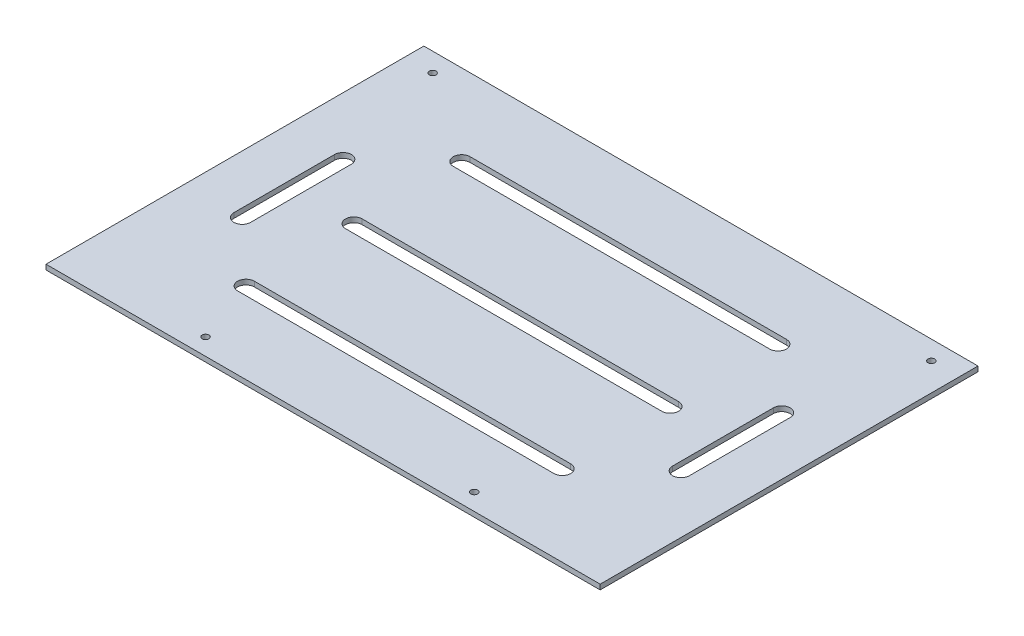
ISO-10303-21;
HEADER;
FILE_DESCRIPTION(('STEP AP214'),'2;1');
FILE_NAME('part.step','',(''),(''),'','','');
FILE_SCHEMA(('AUTOMOTIVE_DESIGN { 1 0 10303 214 1 1 1 1 }'));
ENDSEC;
DATA;
#1=APPLICATION_CONTEXT('core data for automotive mechanical design processes');
#2=APPLICATION_PROTOCOL_DEFINITION('international standard','automotive_design',2000,#1);
#3=PRODUCT_CONTEXT('',#1,'mechanical');
#4=PRODUCT('Part','Part','',(#3));
#5=PRODUCT_RELATED_PRODUCT_CATEGORY('part','',(#4));
#6=PRODUCT_DEFINITION_FORMATION('','',#4);
#7=PRODUCT_DEFINITION_CONTEXT('part definition',#1,'design');
#8=PRODUCT_DEFINITION('design','',#6,#7);
#9=PRODUCT_DEFINITION_SHAPE('','',#8);
#10=(LENGTH_UNIT() NAMED_UNIT(*) SI_UNIT(.MILLI.,.METRE.));
#11=(NAMED_UNIT(*) PLANE_ANGLE_UNIT() SI_UNIT($,.RADIAN.));
#12=(NAMED_UNIT(*) SI_UNIT($,.STERADIAN.) SOLID_ANGLE_UNIT());
#13=UNCERTAINTY_MEASURE_WITH_UNIT(LENGTH_MEASURE(1.E-05),#10,'distance_accuracy_value','');
#14=(GEOMETRIC_REPRESENTATION_CONTEXT(3) GLOBAL_UNCERTAINTY_ASSIGNED_CONTEXT((#13)) GLOBAL_UNIT_ASSIGNED_CONTEXT((#10,
#11,#12)) REPRESENTATION_CONTEXT('',''));
#15=CARTESIAN_POINT('',(0.,0.,0.));
#16=DIRECTION('',(0.,0.,1.));
#17=DIRECTION('',(1.,0.,0.));
#18=AXIS2_PLACEMENT_3D('',#15,#16,#17);
#19=CARTESIAN_POINT('',(-145.588235294118,3.,-128.382352941176));
#20=DIRECTION('',(1.,0.,0.));
#21=DIRECTION('',(0.,0.,-1.));
#22=AXIS2_PLACEMENT_3D('',#19,#20,#21);
#23=PLANE('',#22);
#24=DIRECTION('',(0.,0.,1.));
#25=VECTOR('',#24,1.);
#26=CARTESIAN_POINT('',(-145.588235294118,0.,-128.382352941176));
#27=LINE('',#26,#25);
#28=CARTESIAN_POINT('',(-145.588235294118,0.,-128.382352941176));
#29=VERTEX_POINT('',#28);
#30=CARTESIAN_POINT('',(-145.588235294118,0.,96.6176470588236));
#31=VERTEX_POINT('',#30);
#32=EDGE_CURVE('E381',#29,#31,#27,.T.);
#33=ORIENTED_EDGE('',*,*,#32,.T.);
#34=DIRECTION('',(0.,-1.,0.));
#35=VECTOR('',#34,1.);
#36=CARTESIAN_POINT('',(-145.588235294118,3.,96.6176470588236));
#37=LINE('',#36,#35);
#38=CARTESIAN_POINT('',(-145.588235294118,3.,96.6176470588236));
#39=VERTEX_POINT('',#38);
#40=EDGE_CURVE('E11',#39,#31,#37,.T.);
#41=ORIENTED_EDGE('',*,*,#40,.F.);
#42=DIRECTION('',(0.,0.,1.));
#43=VECTOR('',#42,1.);
#44=CARTESIAN_POINT('',(-145.588235294118,3.,-128.382352941176));
#45=LINE('',#44,#43);
#46=CARTESIAN_POINT('',(-145.588235294118,3.,-128.382352941176));
#47=VERTEX_POINT('',#46);
#48=EDGE_CURVE('E384',#47,#39,#45,.T.);
#49=ORIENTED_EDGE('',*,*,#48,.F.);
#50=DIRECTION('',(0.,-1.,0.));
#51=VECTOR('',#50,1.);
#52=CARTESIAN_POINT('',(-145.588235294118,3.,-128.382352941176));
#53=LINE('',#52,#51);
#54=EDGE_CURVE('E394',#47,#29,#53,.T.);
#55=ORIENTED_EDGE('',*,*,#54,.T.);
#56=EDGE_LOOP('',(#33,#41,#49,#55));
#57=FACE_BOUND('',#56,.T.);
#58=ADVANCED_FACE('F35',(#57),#23,.F.);
#59=CARTESIAN_POINT('',(-145.588235294118,3.,96.6176470588236));
#60=DIRECTION('',(0.,0.,-1.));
#61=DIRECTION('',(-1.,0.,0.));
#62=AXIS2_PLACEMENT_3D('',#59,#60,#61);
#63=PLANE('',#62);
#64=DIRECTION('',(1.,0.,0.));
#65=VECTOR('',#64,1.);
#66=CARTESIAN_POINT('',(-145.588235294118,0.,96.6176470588236));
#67=LINE('',#66,#65);
#68=CARTESIAN_POINT('',(184.411764705882,0.,96.6176470588236));
#69=VERTEX_POINT('',#68);
#70=EDGE_CURVE('E397',#31,#69,#67,.T.);
#71=ORIENTED_EDGE('',*,*,#70,.T.);
#72=DIRECTION('',(0.,-1.,0.));
#73=VECTOR('',#72,1.);
#74=CARTESIAN_POINT('',(184.411764705882,3.,96.6176470588236));
#75=LINE('',#74,#73);
#76=CARTESIAN_POINT('',(184.411764705882,3.,96.6176470588236));
#77=VERTEX_POINT('',#76);
#78=EDGE_CURVE('E42',#77,#69,#75,.T.);
#79=ORIENTED_EDGE('',*,*,#78,.F.);
#80=DIRECTION('',(1.,0.,0.));
#81=VECTOR('',#80,1.);
#82=CARTESIAN_POINT('',(-145.588235294118,3.,96.6176470588236));
#83=LINE('',#82,#81);
#84=EDGE_CURVE('E387',#39,#77,#83,.T.);
#85=ORIENTED_EDGE('',*,*,#84,.F.);
#86=ORIENTED_EDGE('',*,*,#40,.T.);
#87=EDGE_LOOP('',(#71,#79,#85,#86));
#88=FACE_BOUND('',#87,.T.);
#89=ADVANCED_FACE('F426',(#88),#63,.F.);
#90=CARTESIAN_POINT('',(184.411764705882,3.,-128.382352941176));
#91=DIRECTION('',(-1.,0.,0.));
#92=DIRECTION('',(0.,0.,1.));
#93=AXIS2_PLACEMENT_3D('',#90,#91,#92);
#94=PLANE('',#93);
#95=DIRECTION('',(0.,0.,-1.));
#96=VECTOR('',#95,1.);
#97=CARTESIAN_POINT('',(184.411764705882,0.,-128.382352941176));
#98=LINE('',#97,#96);
#99=CARTESIAN_POINT('',(184.411764705882,0.,-128.382352941176));
#100=VERTEX_POINT('',#99);
#101=EDGE_CURVE('E399',#69,#100,#98,.T.);
#102=ORIENTED_EDGE('',*,*,#101,.T.);
#103=DIRECTION('',(0.,-1.,0.));
#104=VECTOR('',#103,1.);
#105=CARTESIAN_POINT('',(184.411764705882,3.,-128.382352941176));
#106=LINE('',#105,#104);
#107=CARTESIAN_POINT('',(184.411764705882,3.,-128.382352941176));
#108=VERTEX_POINT('',#107);
#109=EDGE_CURVE('E404',#108,#100,#106,.T.);
#110=ORIENTED_EDGE('',*,*,#109,.F.);
#111=DIRECTION('',(0.,0.,-1.));
#112=VECTOR('',#111,1.);
#113=CARTESIAN_POINT('',(184.411764705882,3.,-128.382352941176));
#114=LINE('',#113,#112);
#115=EDGE_CURVE('E390',#77,#108,#114,.T.);
#116=ORIENTED_EDGE('',*,*,#115,.F.);
#117=ORIENTED_EDGE('',*,*,#78,.T.);
#118=EDGE_LOOP('',(#102,#110,#116,#117));
#119=FACE_BOUND('',#118,.T.);
#120=ADVANCED_FACE('F411',(#119),#94,.F.);
#121=CARTESIAN_POINT('',(-145.588235294118,3.,-128.382352941176));
#122=DIRECTION('',(0.,0.,1.));
#123=DIRECTION('',(1.,0.,0.));
#124=AXIS2_PLACEMENT_3D('',#121,#122,#123);
#125=PLANE('',#124);
#126=DIRECTION('',(-1.,0.,0.));
#127=VECTOR('',#126,1.);
#128=CARTESIAN_POINT('',(-145.588235294118,0.,-128.382352941176));
#129=LINE('',#128,#127);
#130=EDGE_CURVE('E388',#100,#29,#129,.T.);
#131=ORIENTED_EDGE('',*,*,#130,.T.);
#132=ORIENTED_EDGE('',*,*,#54,.F.);
#133=DIRECTION('',(-1.,0.,0.));
#134=VECTOR('',#133,1.);
#135=CARTESIAN_POINT('',(-145.588235294118,3.,-128.382352941176));
#136=LINE('',#135,#134);
#137=EDGE_CURVE('E392',#108,#47,#136,.T.);
#138=ORIENTED_EDGE('',*,*,#137,.F.);
#139=ORIENTED_EDGE('',*,*,#109,.T.);
#140=EDGE_LOOP('',(#131,#132,#138,#139));
#141=FACE_BOUND('',#140,.T.);
#142=ADVANCED_FACE('F419',(#141),#125,.F.);
#143=CARTESIAN_POINT('',(0.,3.,0.));
#144=DIRECTION('',(0.,1.,0.));
#145=DIRECTION('',(0.,0.,1.));
#146=AXIS2_PLACEMENT_3D('',#143,#144,#145);
#147=PLANE('',#146);
#148=CARTESIAN_POINT('',(-74.7732352941176,3.,-15.8823529411764));
#149=DIRECTION('',(0.,1.,0.));
#150=DIRECTION('',(0.,0.,1.));
#151=AXIS2_PLACEMENT_3D('',#148,#149,#150);
#152=CIRCLE('',#151,5.);
#153=CARTESIAN_POINT('',(-74.7732352941176,3.,-20.8823529411764));
#154=VERTEX_POINT('',#153);
#155=CARTESIAN_POINT('',(-74.7732352941176,3.,-10.8823529411764));
#156=VERTEX_POINT('',#155);
#157=EDGE_CURVE('E49',#154,#156,#152,.T.);
#158=ORIENTED_EDGE('',*,*,#157,.F.);
#159=DIRECTION('',(-1.,0.,0.));
#160=VECTOR('',#159,1.);
#161=CARTESIAN_POINT('',(-74.7732352941176,3.,-20.8823529411764));
#162=LINE('',#161,#160);
#163=CARTESIAN_POINT('',(113.596764705882,3.,-20.8823529411764));
#164=VERTEX_POINT('',#163);
#165=EDGE_CURVE('E213',#164,#154,#162,.T.);
#166=ORIENTED_EDGE('',*,*,#165,.F.);
#167=CARTESIAN_POINT('',(113.596764705882,3.,-15.8823529411764));
#168=DIRECTION('',(0.,1.,0.));
#169=DIRECTION('',(0.,0.,1.));
#170=AXIS2_PLACEMENT_3D('',#167,#168,#169);
#171=CIRCLE('',#170,5.);
#172=CARTESIAN_POINT('',(113.596764705882,3.,-10.8823529411764));
#173=VERTEX_POINT('',#172);
#174=EDGE_CURVE('E216',#173,#164,#171,.T.);
#175=ORIENTED_EDGE('',*,*,#174,.F.);
#176=DIRECTION('',(1.,0.,0.));
#177=VECTOR('',#176,1.);
#178=CARTESIAN_POINT('',(-74.7732352941176,3.,-10.8823529411764));
#179=LINE('',#178,#177);
#180=EDGE_CURVE('E222',#156,#173,#179,.T.);
#181=ORIENTED_EDGE('',*,*,#180,.F.);
#182=EDGE_LOOP('',(#158,#166,#175,#181));
#183=FACE_BOUND('',#182,.T.);
#184=CARTESIAN_POINT('',(-74.7746020871112,3.,48.3356244176828));
#185=DIRECTION('',(0.,1.,0.));
#186=DIRECTION('',(0.,0.,-1.));
#187=AXIS2_PLACEMENT_3D('',#184,#185,#186);
#188=CIRCLE('',#187,5.);
#189=CARTESIAN_POINT('',(-74.7746020871112,3.,43.3356244176828));
#190=VERTEX_POINT('',#189);
#191=CARTESIAN_POINT('',(-74.7746020871112,3.,53.3356244176828));
#192=VERTEX_POINT('',#191);
#193=EDGE_CURVE('E228',#190,#192,#188,.T.);
#194=ORIENTED_EDGE('',*,*,#193,.F.);
#195=DIRECTION('',(-1.,0.,0.));
#196=VECTOR('',#195,1.);
#197=CARTESIAN_POINT('',(-74.7746020871112,3.,43.3356244176828));
#198=LINE('',#197,#196);
#199=CARTESIAN_POINT('',(113.598131498876,3.,43.3356244176828));
#200=VERTEX_POINT('',#199);
#201=EDGE_CURVE('E236',#200,#190,#198,.T.);
#202=ORIENTED_EDGE('',*,*,#201,.F.);
#203=CARTESIAN_POINT('',(113.598131498876,3.,48.3356244176828));
#204=DIRECTION('',(0.,1.,0.));
#205=DIRECTION('',(0.,0.,-1.));
#206=AXIS2_PLACEMENT_3D('',#203,#204,#205);
#207=CIRCLE('',#206,5.);
#208=CARTESIAN_POINT('',(113.598131498876,3.,53.3356244176829));
#209=VERTEX_POINT('',#208);
#210=EDGE_CURVE('E250',#209,#200,#207,.T.);
#211=ORIENTED_EDGE('',*,*,#210,.F.);
#212=DIRECTION('',(1.,0.,0.));
#213=VECTOR('',#212,1.);
#214=CARTESIAN_POINT('',(-74.7746020871112,3.,53.3356244176828));
#215=LINE('',#214,#213);
#216=EDGE_CURVE('E247',#192,#209,#215,.T.);
#217=ORIENTED_EDGE('',*,*,#216,.F.);
#218=EDGE_LOOP('',(#194,#202,#211,#217));
#219=FACE_BOUND('',#218,.T.);
#220=CARTESIAN_POINT('',(-74.7746020871112,3.,-80.1003303000357));
#221=DIRECTION('',(0.,1.,0.));
#222=DIRECTION('',(0.,0.,1.));
#223=AXIS2_PLACEMENT_3D('',#220,#221,#222);
#224=CIRCLE('',#223,5.);
#225=CARTESIAN_POINT('',(-74.7746020871112,3.,-85.1003303000357));
#226=VERTEX_POINT('',#225);
#227=CARTESIAN_POINT('',(-74.7746020871112,3.,-75.1003303000356));
#228=VERTEX_POINT('',#227);
#229=EDGE_CURVE('E257',#226,#228,#224,.T.);
#230=ORIENTED_EDGE('',*,*,#229,.F.);
#231=DIRECTION('',(-1.,0.,0.));
#232=VECTOR('',#231,1.);
#233=CARTESIAN_POINT('',(-74.7746020871112,3.,-85.1003303000357));
#234=LINE('',#233,#232);
#235=CARTESIAN_POINT('',(113.598131498876,3.,-85.1003303000357));
#236=VERTEX_POINT('',#235);
#237=EDGE_CURVE('E268',#236,#226,#234,.T.);
#238=ORIENTED_EDGE('',*,*,#237,.F.);
#239=CARTESIAN_POINT('',(113.598131498876,3.,-80.1003303000356));
#240=DIRECTION('',(0.,1.,0.));
#241=DIRECTION('',(0.,0.,1.));
#242=AXIS2_PLACEMENT_3D('',#239,#240,#241);
#243=CIRCLE('',#242,5.);
#244=CARTESIAN_POINT('',(113.598131498876,3.,-75.1003303000356));
#245=VERTEX_POINT('',#244);
#246=EDGE_CURVE('E282',#245,#236,#243,.T.);
#247=ORIENTED_EDGE('',*,*,#246,.F.);
#248=DIRECTION('',(1.,0.,0.));
#249=VECTOR('',#248,1.);
#250=CARTESIAN_POINT('',(-74.7746020871112,3.,-75.1003303000356));
#251=LINE('',#250,#249);
#252=EDGE_CURVE('E279',#228,#245,#251,.T.);
#253=ORIENTED_EDGE('',*,*,#252,.F.);
#254=EDGE_LOOP('',(#230,#238,#247,#253));
#255=FACE_BOUND('',#254,.T.);
#256=CARTESIAN_POINT('',(150.058760682521,3.,14.1176470588236));
#257=DIRECTION('',(0.,1.,0.));
#258=DIRECTION('',(0.,0.,-1.));
#259=AXIS2_PLACEMENT_3D('',#256,#257,#258);
#260=CIRCLE('',#259,5.);
#261=CARTESIAN_POINT('',(145.058760682521,3.,14.1176470588236));
#262=VERTEX_POINT('',#261);
#263=CARTESIAN_POINT('',(155.058760682521,3.,14.1176470588236));
#264=VERTEX_POINT('',#263);
#265=EDGE_CURVE('E289',#262,#264,#260,.T.);
#266=ORIENTED_EDGE('',*,*,#265,.F.);
#267=DIRECTION('',(0.,0.,1.));
#268=VECTOR('',#267,1.);
#269=CARTESIAN_POINT('',(145.058760682521,3.,14.1176470588236));
#270=LINE('',#269,#268);
#271=CARTESIAN_POINT('',(145.058760682521,3.,-45.8823529411764));
#272=VERTEX_POINT('',#271);
#273=EDGE_CURVE('E300',#272,#262,#270,.T.);
#274=ORIENTED_EDGE('',*,*,#273,.F.);
#275=CARTESIAN_POINT('',(150.058760682521,3.,-45.8823529411764));
#276=DIRECTION('',(0.,1.,0.));
#277=DIRECTION('',(0.,0.,-1.));
#278=AXIS2_PLACEMENT_3D('',#275,#276,#277);
#279=CIRCLE('',#278,5.);
#280=CARTESIAN_POINT('',(155.058760682521,3.,-45.8823529411764));
#281=VERTEX_POINT('',#280);
#282=EDGE_CURVE('E314',#281,#272,#279,.T.);
#283=ORIENTED_EDGE('',*,*,#282,.F.);
#284=DIRECTION('',(0.,0.,-1.));
#285=VECTOR('',#284,1.);
#286=CARTESIAN_POINT('',(155.058760682521,3.,14.1176470588236));
#287=LINE('',#286,#285);
#288=EDGE_CURVE('E311',#264,#281,#287,.T.);
#289=ORIENTED_EDGE('',*,*,#288,.F.);
#290=EDGE_LOOP('',(#266,#274,#283,#289));
#291=FACE_BOUND('',#290,.T.);
#292=CARTESIAN_POINT('',(-111.235231270757,3.,14.1176470588236));
#293=DIRECTION('',(0.,1.,0.));
#294=DIRECTION('',(0.,0.,1.));
#295=AXIS2_PLACEMENT_3D('',#292,#293,#294);
#296=CIRCLE('',#295,5.);
#297=CARTESIAN_POINT('',(-116.235231270757,3.,14.1176470588236));
#298=VERTEX_POINT('',#297);
#299=CARTESIAN_POINT('',(-106.235231270757,3.,14.1176470588236));
#300=VERTEX_POINT('',#299);
#301=EDGE_CURVE('E321',#298,#300,#296,.T.);
#302=ORIENTED_EDGE('',*,*,#301,.F.);
#303=DIRECTION('',(0.,0.,1.));
#304=VECTOR('',#303,1.);
#305=CARTESIAN_POINT('',(-116.235231270757,3.,14.1176470588236));
#306=LINE('',#305,#304);
#307=CARTESIAN_POINT('',(-116.235231270757,3.,-45.8823529411764));
#308=VERTEX_POINT('',#307);
#309=EDGE_CURVE('E332',#308,#298,#306,.T.);
#310=ORIENTED_EDGE('',*,*,#309,.F.);
#311=CARTESIAN_POINT('',(-111.235231270757,3.,-45.8823529411764));
#312=DIRECTION('',(0.,1.,0.));
#313=DIRECTION('',(0.,0.,1.));
#314=AXIS2_PLACEMENT_3D('',#311,#312,#313);
#315=CIRCLE('',#314,5.);
#316=CARTESIAN_POINT('',(-106.235231270757,3.,-45.8823529411764));
#317=VERTEX_POINT('',#316);
#318=EDGE_CURVE('E346',#317,#308,#315,.T.);
#319=ORIENTED_EDGE('',*,*,#318,.F.);
#320=DIRECTION('',(0.,0.,-1.));
#321=VECTOR('',#320,1.);
#322=CARTESIAN_POINT('',(-106.235231270757,3.,14.1176470588236));
#323=LINE('',#322,#321);
#324=EDGE_CURVE('E343',#300,#317,#323,.T.);
#325=ORIENTED_EDGE('',*,*,#324,.F.);
#326=EDGE_LOOP('',(#302,#310,#319,#325));
#327=FACE_BOUND('',#326,.T.);
#328=CARTESIAN_POINT('',(167.887217849731,3.,-117.115616448346));
#329=DIRECTION('',(0.,1.,0.));
#330=DIRECTION('',(0.,0.,-1.));
#331=AXIS2_PLACEMENT_3D('',#328,#329,#330);
#332=CIRCLE('',#331,2.);
#333=CARTESIAN_POINT('',(167.887217849731,3.,-119.115616448346));
#334=VERTEX_POINT('',#333);
#335=EDGE_CURVE('E364',#334,#334,#332,.T.);
#336=ORIENTED_EDGE('',*,*,#335,.F.);
#337=EDGE_LOOP('',(#336));
#338=FACE_BOUND('',#337,.T.);
#339=CARTESIAN_POINT('',(-60.5882352941176,3.,86.6176470588236));
#340=DIRECTION('',(0.,1.,0.));
#341=DIRECTION('',(0.,0.,1.));
#342=AXIS2_PLACEMENT_3D('',#339,#340,#341);
#343=CIRCLE('',#342,2.);
#344=CARTESIAN_POINT('',(-60.5882352941176,3.,88.6176470588236));
#345=VERTEX_POINT('',#344);
#346=EDGE_CURVE('E370',#345,#345,#343,.T.);
#347=ORIENTED_EDGE('',*,*,#346,.F.);
#348=EDGE_LOOP('',(#347));
#349=FACE_BOUND('',#348,.T.);
#350=CARTESIAN_POINT('',(99.4117647058823,3.,86.6176470588236));
#351=DIRECTION('',(0.,1.,0.));
#352=DIRECTION('',(0.,0.,-1.));
#353=AXIS2_PLACEMENT_3D('',#350,#351,#352);
#354=CIRCLE('',#353,2.00000000000001);
#355=CARTESIAN_POINT('',(99.4117647058823,3.,84.6176470588236));
#356=VERTEX_POINT('',#355);
#357=EDGE_CURVE('E353',#356,#356,#354,.T.);
#358=ORIENTED_EDGE('',*,*,#357,.F.);
#359=EDGE_LOOP('',(#358));
#360=FACE_BOUND('',#359,.T.);
#361=CARTESIAN_POINT('',(-129.063688437967,3.,-117.115616448346));
#362=DIRECTION('',(0.,1.,0.));
#363=DIRECTION('',(0.,0.,1.));
#364=AXIS2_PLACEMENT_3D('',#361,#362,#363);
#365=CIRCLE('',#364,2.);
#366=CARTESIAN_POINT('',(-129.063688437967,3.,-115.115616448346));
#367=VERTEX_POINT('',#366);
#368=EDGE_CURVE('E363',#367,#367,#365,.T.);
#369=ORIENTED_EDGE('',*,*,#368,.F.);
#370=EDGE_LOOP('',(#369));
#371=FACE_BOUND('',#370,.T.);
#372=ORIENTED_EDGE('',*,*,#48,.T.);
#373=ORIENTED_EDGE('',*,*,#84,.T.);
#374=ORIENTED_EDGE('',*,*,#115,.T.);
#375=ORIENTED_EDGE('',*,*,#137,.T.);
#376=EDGE_LOOP('',(#372,#373,#374,#375));
#377=FACE_BOUND('',#376,.T.);
#378=ADVANCED_FACE('F425',(#183,#219,#255,#291,#327,#338,#349,#360,#371,#377),#147,.T.);
#379=CARTESIAN_POINT('',(0.,0.,0.));
#380=DIRECTION('',(0.,1.,0.));
#381=DIRECTION('',(0.,0.,1.));
#382=AXIS2_PLACEMENT_3D('',#379,#380,#381);
#383=PLANE('',#382);
#384=DIRECTION('',(-1.,0.,0.));
#385=VECTOR('',#384,1.);
#386=CARTESIAN_POINT('',(-74.7732352941176,0.,-20.8823529411764));
#387=LINE('',#386,#385);
#388=CARTESIAN_POINT('',(113.596764705882,0.,-20.8823529411764));
#389=VERTEX_POINT('',#388);
#390=CARTESIAN_POINT('',(-74.7732352941176,0.,-20.8823529411764));
#391=VERTEX_POINT('',#390);
#392=EDGE_CURVE('E203',#389,#391,#387,.T.);
#393=ORIENTED_EDGE('',*,*,#392,.T.);
#394=CARTESIAN_POINT('',(-74.7732352941176,0.,-15.8823529411764));
#395=DIRECTION('',(0.,1.,0.));
#396=DIRECTION('',(0.,0.,1.));
#397=AXIS2_PLACEMENT_3D('',#394,#395,#396);
#398=CIRCLE('',#397,5.);
#399=CARTESIAN_POINT('',(-74.7732352941176,0.,-10.8823529411764));
#400=VERTEX_POINT('',#399);
#401=EDGE_CURVE('E197',#391,#400,#398,.T.);
#402=ORIENTED_EDGE('',*,*,#401,.T.);
#403=DIRECTION('',(1.,0.,0.));
#404=VECTOR('',#403,1.);
#405=CARTESIAN_POINT('',(-74.7732352941176,0.,-10.8823529411764));
#406=LINE('',#405,#404);
#407=CARTESIAN_POINT('',(113.596764705882,0.,-10.8823529411764));
#408=VERTEX_POINT('',#407);
#409=EDGE_CURVE('E206',#400,#408,#406,.T.);
#410=ORIENTED_EDGE('',*,*,#409,.T.);
#411=CARTESIAN_POINT('',(113.596764705882,0.,-15.8823529411764));
#412=DIRECTION('',(0.,1.,0.));
#413=DIRECTION('',(0.,0.,1.));
#414=AXIS2_PLACEMENT_3D('',#411,#412,#413);
#415=CIRCLE('',#414,5.);
#416=EDGE_CURVE('E57',#408,#389,#415,.T.);
#417=ORIENTED_EDGE('',*,*,#416,.T.);
#418=EDGE_LOOP('',(#393,#402,#410,#417));
#419=FACE_BOUND('',#418,.T.);
#420=DIRECTION('',(-1.,0.,0.));
#421=VECTOR('',#420,1.);
#422=CARTESIAN_POINT('',(-74.7746020871112,0.,43.3356244176828));
#423=LINE('',#422,#421);
#424=CARTESIAN_POINT('',(113.598131498876,0.,43.3356244176828));
#425=VERTEX_POINT('',#424);
#426=CARTESIAN_POINT('',(-74.7746020871112,0.,43.3356244176828));
#427=VERTEX_POINT('',#426);
#428=EDGE_CURVE('E242',#425,#427,#423,.T.);
#429=ORIENTED_EDGE('',*,*,#428,.T.);
#430=CARTESIAN_POINT('',(-74.7746020871112,0.,48.3356244176828));
#431=DIRECTION('',(0.,1.,0.));
#432=DIRECTION('',(0.,0.,-1.));
#433=AXIS2_PLACEMENT_3D('',#430,#431,#432);
#434=CIRCLE('',#433,5.);
#435=CARTESIAN_POINT('',(-74.7746020871112,0.,53.3356244176828));
#436=VERTEX_POINT('',#435);
#437=EDGE_CURVE('E232',#427,#436,#434,.T.);
#438=ORIENTED_EDGE('',*,*,#437,.T.);
#439=DIRECTION('',(1.,0.,0.));
#440=VECTOR('',#439,1.);
#441=CARTESIAN_POINT('',(-74.7746020871112,0.,53.3356244176828));
#442=LINE('',#441,#440);
#443=CARTESIAN_POINT('',(113.598131498876,0.,53.3356244176829));
#444=VERTEX_POINT('',#443);
#445=EDGE_CURVE('E235',#436,#444,#442,.T.);
#446=ORIENTED_EDGE('',*,*,#445,.T.);
#447=CARTESIAN_POINT('',(113.598131498876,0.,48.3356244176828));
#448=DIRECTION('',(0.,1.,0.));
#449=DIRECTION('',(0.,0.,-1.));
#450=AXIS2_PLACEMENT_3D('',#447,#448,#449);
#451=CIRCLE('',#450,5.);
#452=EDGE_CURVE('E239',#444,#425,#451,.T.);
#453=ORIENTED_EDGE('',*,*,#452,.T.);
#454=EDGE_LOOP('',(#429,#438,#446,#453));
#455=FACE_BOUND('',#454,.T.);
#456=DIRECTION('',(-1.,0.,0.));
#457=VECTOR('',#456,1.);
#458=CARTESIAN_POINT('',(-74.7746020871112,0.,-85.1003303000357));
#459=LINE('',#458,#457);
#460=CARTESIAN_POINT('',(113.598131498876,0.,-85.1003303000357));
#461=VERTEX_POINT('',#460);
#462=CARTESIAN_POINT('',(-74.7746020871112,0.,-85.1003303000357));
#463=VERTEX_POINT('',#462);
#464=EDGE_CURVE('E274',#461,#463,#459,.T.);
#465=ORIENTED_EDGE('',*,*,#464,.T.);
#466=CARTESIAN_POINT('',(-74.7746020871112,0.,-80.1003303000357));
#467=DIRECTION('',(0.,1.,0.));
#468=DIRECTION('',(0.,0.,1.));
#469=AXIS2_PLACEMENT_3D('',#466,#467,#468);
#470=CIRCLE('',#469,5.);
#471=CARTESIAN_POINT('',(-74.7746020871112,0.,-75.1003303000356));
#472=VERTEX_POINT('',#471);
#473=EDGE_CURVE('E264',#463,#472,#470,.T.);
#474=ORIENTED_EDGE('',*,*,#473,.T.);
#475=DIRECTION('',(1.,0.,0.));
#476=VECTOR('',#475,1.);
#477=CARTESIAN_POINT('',(-74.7746020871112,0.,-75.1003303000356));
#478=LINE('',#477,#476);
#479=CARTESIAN_POINT('',(113.598131498876,0.,-75.1003303000356));
#480=VERTEX_POINT('',#479);
#481=EDGE_CURVE('E267',#472,#480,#478,.T.);
#482=ORIENTED_EDGE('',*,*,#481,.T.);
#483=CARTESIAN_POINT('',(113.598131498876,0.,-80.1003303000356));
#484=DIRECTION('',(0.,1.,0.));
#485=DIRECTION('',(0.,0.,1.));
#486=AXIS2_PLACEMENT_3D('',#483,#484,#485);
#487=CIRCLE('',#486,5.);
#488=EDGE_CURVE('E271',#480,#461,#487,.T.);
#489=ORIENTED_EDGE('',*,*,#488,.T.);
#490=EDGE_LOOP('',(#465,#474,#482,#489));
#491=FACE_BOUND('',#490,.T.);
#492=DIRECTION('',(0.,0.,1.));
#493=VECTOR('',#492,1.);
#494=CARTESIAN_POINT('',(145.058760682521,0.,14.1176470588236));
#495=LINE('',#494,#493);
#496=CARTESIAN_POINT('',(145.058760682521,0.,-45.8823529411764));
#497=VERTEX_POINT('',#496);
#498=CARTESIAN_POINT('',(145.058760682521,0.,14.1176470588236));
#499=VERTEX_POINT('',#498);
#500=EDGE_CURVE('E306',#497,#499,#495,.T.);
#501=ORIENTED_EDGE('',*,*,#500,.T.);
#502=CARTESIAN_POINT('',(150.058760682521,0.,14.1176470588236));
#503=DIRECTION('',(0.,1.,0.));
#504=DIRECTION('',(0.,0.,-1.));
#505=AXIS2_PLACEMENT_3D('',#502,#503,#504);
#506=CIRCLE('',#505,5.);
#507=CARTESIAN_POINT('',(155.058760682521,0.,14.1176470588236));
#508=VERTEX_POINT('',#507);
#509=EDGE_CURVE('E296',#499,#508,#506,.T.);
#510=ORIENTED_EDGE('',*,*,#509,.T.);
#511=DIRECTION('',(0.,0.,-1.));
#512=VECTOR('',#511,1.);
#513=CARTESIAN_POINT('',(155.058760682521,0.,14.1176470588236));
#514=LINE('',#513,#512);
#515=CARTESIAN_POINT('',(155.058760682521,0.,-45.8823529411764));
#516=VERTEX_POINT('',#515);
#517=EDGE_CURVE('E299',#508,#516,#514,.T.);
#518=ORIENTED_EDGE('',*,*,#517,.T.);
#519=CARTESIAN_POINT('',(150.058760682521,0.,-45.8823529411764));
#520=DIRECTION('',(0.,1.,0.));
#521=DIRECTION('',(0.,0.,-1.));
#522=AXIS2_PLACEMENT_3D('',#519,#520,#521);
#523=CIRCLE('',#522,5.);
#524=EDGE_CURVE('E303',#516,#497,#523,.T.);
#525=ORIENTED_EDGE('',*,*,#524,.T.);
#526=EDGE_LOOP('',(#501,#510,#518,#525));
#527=FACE_BOUND('',#526,.T.);
#528=DIRECTION('',(0.,0.,1.));
#529=VECTOR('',#528,1.);
#530=CARTESIAN_POINT('',(-116.235231270757,0.,14.1176470588236));
#531=LINE('',#530,#529);
#532=CARTESIAN_POINT('',(-116.235231270757,0.,-45.8823529411764));
#533=VERTEX_POINT('',#532);
#534=CARTESIAN_POINT('',(-116.235231270757,0.,14.1176470588236));
#535=VERTEX_POINT('',#534);
#536=EDGE_CURVE('E338',#533,#535,#531,.T.);
#537=ORIENTED_EDGE('',*,*,#536,.T.);
#538=CARTESIAN_POINT('',(-111.235231270757,0.,14.1176470588236));
#539=DIRECTION('',(0.,1.,0.));
#540=DIRECTION('',(0.,0.,1.));
#541=AXIS2_PLACEMENT_3D('',#538,#539,#540);
#542=CIRCLE('',#541,5.);
#543=CARTESIAN_POINT('',(-106.235231270757,0.,14.1176470588236));
#544=VERTEX_POINT('',#543);
#545=EDGE_CURVE('E328',#535,#544,#542,.T.);
#546=ORIENTED_EDGE('',*,*,#545,.T.);
#547=DIRECTION('',(0.,0.,-1.));
#548=VECTOR('',#547,1.);
#549=CARTESIAN_POINT('',(-106.235231270757,0.,14.1176470588236));
#550=LINE('',#549,#548);
#551=CARTESIAN_POINT('',(-106.235231270757,0.,-45.8823529411764));
#552=VERTEX_POINT('',#551);
#553=EDGE_CURVE('E331',#544,#552,#550,.T.);
#554=ORIENTED_EDGE('',*,*,#553,.T.);
#555=CARTESIAN_POINT('',(-111.235231270757,0.,-45.8823529411764));
#556=DIRECTION('',(0.,1.,0.));
#557=DIRECTION('',(0.,0.,1.));
#558=AXIS2_PLACEMENT_3D('',#555,#556,#557);
#559=CIRCLE('',#558,5.);
#560=EDGE_CURVE('E335',#552,#533,#559,.T.);
#561=ORIENTED_EDGE('',*,*,#560,.T.);
#562=EDGE_LOOP('',(#537,#546,#554,#561));
#563=FACE_BOUND('',#562,.T.);
#564=CARTESIAN_POINT('',(167.887217849731,0.,-117.115616448346));
#565=DIRECTION('',(0.,1.,0.));
#566=DIRECTION('',(0.,0.,-1.));
#567=AXIS2_PLACEMENT_3D('',#564,#565,#566);
#568=CIRCLE('',#567,2.);
#569=CARTESIAN_POINT('',(167.887217849731,0.,-119.115616448346));
#570=VERTEX_POINT('',#569);
#571=EDGE_CURVE('E360',#570,#570,#568,.T.);
#572=ORIENTED_EDGE('',*,*,#571,.T.);
#573=EDGE_LOOP('',(#572));
#574=FACE_BOUND('',#573,.T.);
#575=CARTESIAN_POINT('',(-60.5882352941176,0.,86.6176470588236));
#576=DIRECTION('',(0.,1.,0.));
#577=DIRECTION('',(0.,0.,1.));
#578=AXIS2_PLACEMENT_3D('',#575,#576,#577);
#579=CIRCLE('',#578,2.);
#580=CARTESIAN_POINT('',(-60.5882352941176,0.,88.6176470588236));
#581=VERTEX_POINT('',#580);
#582=EDGE_CURVE('E367',#581,#581,#579,.T.);
#583=ORIENTED_EDGE('',*,*,#582,.T.);
#584=EDGE_LOOP('',(#583));
#585=FACE_BOUND('',#584,.T.);
#586=CARTESIAN_POINT('',(99.4117647058823,0.,86.6176470588236));
#587=DIRECTION('',(0.,1.,0.));
#588=DIRECTION('',(0.,0.,-1.));
#589=AXIS2_PLACEMENT_3D('',#586,#587,#588);
#590=CIRCLE('',#589,2.00000000000001);
#591=CARTESIAN_POINT('',(99.4117647058823,0.,84.6176470588236));
#592=VERTEX_POINT('',#591);
#593=EDGE_CURVE('E373',#592,#592,#590,.T.);
#594=ORIENTED_EDGE('',*,*,#593,.T.);
#595=EDGE_LOOP('',(#594));
#596=FACE_BOUND('',#595,.T.);
#597=CARTESIAN_POINT('',(-129.063688437967,0.,-117.115616448346));
#598=DIRECTION('',(0.,1.,0.));
#599=DIRECTION('',(0.,0.,1.));
#600=AXIS2_PLACEMENT_3D('',#597,#598,#599);
#601=CIRCLE('',#600,2.);
#602=CARTESIAN_POINT('',(-129.063688437967,0.,-115.115616448346));
#603=VERTEX_POINT('',#602);
#604=EDGE_CURVE('E378',#603,#603,#601,.T.);
#605=ORIENTED_EDGE('',*,*,#604,.T.);
#606=EDGE_LOOP('',(#605));
#607=FACE_BOUND('',#606,.T.);
#608=ORIENTED_EDGE('',*,*,#32,.F.);
#609=ORIENTED_EDGE('',*,*,#130,.F.);
#610=ORIENTED_EDGE('',*,*,#101,.F.);
#611=ORIENTED_EDGE('',*,*,#70,.F.);
#612=EDGE_LOOP('',(#608,#609,#610,#611));
#613=FACE_BOUND('',#612,.T.);
#614=ADVANCED_FACE('F210',(#419,#455,#491,#527,#563,#574,#585,#596,#607,#613),#383,.F.);
#615=CARTESIAN_POINT('',(-129.063688437967,0.,-117.115616448346));
#616=DIRECTION('',(0.,1.,0.));
#617=DIRECTION('',(0.,0.,1.));
#618=AXIS2_PLACEMENT_3D('',#615,#616,#617);
#619=CYLINDRICAL_SURFACE('',#618,2.);
#620=ORIENTED_EDGE('',*,*,#604,.F.);
#621=EDGE_LOOP('',(#620));
#622=FACE_BOUND('',#621,.T.);
#623=ORIENTED_EDGE('',*,*,#368,.T.);
#624=EDGE_LOOP('',(#623));
#625=FACE_BOUND('',#624,.T.);
#626=ADVANCED_FACE('F438',(#622,#625),#619,.F.);
#627=CARTESIAN_POINT('',(99.4117647058823,0.,86.6176470588236));
#628=DIRECTION('',(0.,1.,0.));
#629=DIRECTION('',(0.,0.,1.));
#630=AXIS2_PLACEMENT_3D('',#627,#628,#629);
#631=CYLINDRICAL_SURFACE('',#630,2.00000000000001);
#632=ORIENTED_EDGE('',*,*,#593,.F.);
#633=EDGE_LOOP('',(#632));
#634=FACE_BOUND('',#633,.T.);
#635=ORIENTED_EDGE('',*,*,#357,.T.);
#636=EDGE_LOOP('',(#635));
#637=FACE_BOUND('',#636,.T.);
#638=ADVANCED_FACE('F444',(#634,#637),#631,.F.);
#639=CARTESIAN_POINT('',(-60.5882352941176,0.,86.6176470588236));
#640=DIRECTION('',(0.,1.,0.));
#641=DIRECTION('',(0.,0.,1.));
#642=AXIS2_PLACEMENT_3D('',#639,#640,#641);
#643=CYLINDRICAL_SURFACE('',#642,2.);
#644=ORIENTED_EDGE('',*,*,#582,.F.);
#645=EDGE_LOOP('',(#644));
#646=FACE_BOUND('',#645,.T.);
#647=ORIENTED_EDGE('',*,*,#346,.T.);
#648=EDGE_LOOP('',(#647));
#649=FACE_BOUND('',#648,.T.);
#650=ADVANCED_FACE('F448',(#646,#649),#643,.F.);
#651=CARTESIAN_POINT('',(167.887217849731,0.,-117.115616448346));
#652=DIRECTION('',(0.,1.,0.));
#653=DIRECTION('',(0.,0.,1.));
#654=AXIS2_PLACEMENT_3D('',#651,#652,#653);
#655=CYLINDRICAL_SURFACE('',#654,2.);
#656=ORIENTED_EDGE('',*,*,#571,.F.);
#657=EDGE_LOOP('',(#656));
#658=FACE_BOUND('',#657,.T.);
#659=ORIENTED_EDGE('',*,*,#335,.T.);
#660=EDGE_LOOP('',(#659));
#661=FACE_BOUND('',#660,.T.);
#662=ADVANCED_FACE('F452',(#658,#661),#655,.F.);
#663=CARTESIAN_POINT('',(-111.235231270757,0.,14.1176470588236));
#664=DIRECTION('',(0.,1.,0.));
#665=DIRECTION('',(0.,0.,1.));
#666=AXIS2_PLACEMENT_3D('',#663,#664,#665);
#667=CYLINDRICAL_SURFACE('',#666,5.);
#668=ORIENTED_EDGE('',*,*,#301,.T.);
#669=DIRECTION('',(0.,1.,0.));
#670=VECTOR('',#669,1.);
#671=CARTESIAN_POINT('',(-106.235231270757,0.,14.1176470588236));
#672=LINE('',#671,#670);
#673=EDGE_CURVE('E341',#544,#300,#672,.T.);
#674=ORIENTED_EDGE('',*,*,#673,.F.);
#675=ORIENTED_EDGE('',*,*,#545,.F.);
#676=DIRECTION('',(0.,1.,0.));
#677=VECTOR('',#676,1.);
#678=CARTESIAN_POINT('',(-116.235231270757,0.,14.1176470588236));
#679=LINE('',#678,#677);
#680=EDGE_CURVE('E351',#535,#298,#679,.T.);
#681=ORIENTED_EDGE('',*,*,#680,.T.);
#682=EDGE_LOOP('',(#668,#674,#675,#681));
#683=FACE_BOUND('',#682,.T.);
#684=ADVANCED_FACE('F456',(#683),#667,.F.);
#685=CARTESIAN_POINT('',(-116.235231270757,0.,14.1176470588236));
#686=DIRECTION('',(-1.,0.,0.));
#687=DIRECTION('',(0.,0.,1.));
#688=AXIS2_PLACEMENT_3D('',#685,#686,#687);
#689=PLANE('',#688);
#690=ORIENTED_EDGE('',*,*,#309,.T.);
#691=ORIENTED_EDGE('',*,*,#680,.F.);
#692=ORIENTED_EDGE('',*,*,#536,.F.);
#693=DIRECTION('',(0.,1.,0.));
#694=VECTOR('',#693,1.);
#695=CARTESIAN_POINT('',(-116.235231270757,0.,-45.8823529411764));
#696=LINE('',#695,#694);
#697=EDGE_CURVE('E354',#533,#308,#696,.T.);
#698=ORIENTED_EDGE('',*,*,#697,.T.);
#699=EDGE_LOOP('',(#690,#691,#692,#698));
#700=FACE_BOUND('',#699,.T.);
#701=ADVANCED_FACE('F460',(#700),#689,.F.);
#702=CARTESIAN_POINT('',(-111.235231270757,0.,-45.8823529411764));
#703=DIRECTION('',(0.,1.,0.));
#704=DIRECTION('',(0.,0.,1.));
#705=AXIS2_PLACEMENT_3D('',#702,#703,#704);
#706=CYLINDRICAL_SURFACE('',#705,5.);
#707=ORIENTED_EDGE('',*,*,#318,.T.);
#708=ORIENTED_EDGE('',*,*,#697,.F.);
#709=ORIENTED_EDGE('',*,*,#560,.F.);
#710=DIRECTION('',(0.,1.,0.));
#711=VECTOR('',#710,1.);
#712=CARTESIAN_POINT('',(-106.235231270757,0.,-45.8823529411764));
#713=LINE('',#712,#711);
#714=EDGE_CURVE('E356',#552,#317,#713,.T.);
#715=ORIENTED_EDGE('',*,*,#714,.T.);
#716=EDGE_LOOP('',(#707,#708,#709,#715));
#717=FACE_BOUND('',#716,.T.);
#718=ADVANCED_FACE('F466',(#717),#706,.F.);
#719=CARTESIAN_POINT('',(-106.235231270757,0.,14.1176470588236));
#720=DIRECTION('',(1.,0.,0.));
#721=DIRECTION('',(0.,0.,-1.));
#722=AXIS2_PLACEMENT_3D('',#719,#720,#721);
#723=PLANE('',#722);
#724=ORIENTED_EDGE('',*,*,#324,.T.);
#725=ORIENTED_EDGE('',*,*,#714,.F.);
#726=ORIENTED_EDGE('',*,*,#553,.F.);
#727=ORIENTED_EDGE('',*,*,#673,.T.);
#728=EDGE_LOOP('',(#724,#725,#726,#727));
#729=FACE_BOUND('',#728,.T.);
#730=ADVANCED_FACE('F462',(#729),#723,.F.);
#731=CARTESIAN_POINT('',(150.058760682521,0.,14.1176470588236));
#732=DIRECTION('',(0.,1.,0.));
#733=DIRECTION('',(0.,0.,1.));
#734=AXIS2_PLACEMENT_3D('',#731,#732,#733);
#735=CYLINDRICAL_SURFACE('',#734,5.);
#736=ORIENTED_EDGE('',*,*,#265,.T.);
#737=DIRECTION('',(0.,1.,0.));
#738=VECTOR('',#737,1.);
#739=CARTESIAN_POINT('',(155.058760682521,0.,14.1176470588236));
#740=LINE('',#739,#738);
#741=EDGE_CURVE('E309',#508,#264,#740,.T.);
#742=ORIENTED_EDGE('',*,*,#741,.F.);
#743=ORIENTED_EDGE('',*,*,#509,.F.);
#744=DIRECTION('',(0.,1.,0.));
#745=VECTOR('',#744,1.);
#746=CARTESIAN_POINT('',(145.058760682521,0.,14.1176470588236));
#747=LINE('',#746,#745);
#748=EDGE_CURVE('E319',#499,#262,#747,.T.);
#749=ORIENTED_EDGE('',*,*,#748,.T.);
#750=EDGE_LOOP('',(#736,#742,#743,#749));
#751=FACE_BOUND('',#750,.T.);
#752=ADVANCED_FACE('F465',(#751),#735,.F.);
#753=CARTESIAN_POINT('',(145.058760682521,0.,14.1176470588236));
#754=DIRECTION('',(-1.,0.,0.));
#755=DIRECTION('',(0.,0.,1.));
#756=AXIS2_PLACEMENT_3D('',#753,#754,#755);
#757=PLANE('',#756);
#758=ORIENTED_EDGE('',*,*,#273,.T.);
#759=ORIENTED_EDGE('',*,*,#748,.F.);
#760=ORIENTED_EDGE('',*,*,#500,.F.);
#761=DIRECTION('',(0.,1.,0.));
#762=VECTOR('',#761,1.);
#763=CARTESIAN_POINT('',(145.058760682521,0.,-45.8823529411764));
#764=LINE('',#763,#762);
#765=EDGE_CURVE('E322',#497,#272,#764,.T.);
#766=ORIENTED_EDGE('',*,*,#765,.T.);
#767=EDGE_LOOP('',(#758,#759,#760,#766));
#768=FACE_BOUND('',#767,.T.);
#769=ADVANCED_FACE('F476',(#768),#757,.F.);
#770=CARTESIAN_POINT('',(150.058760682521,0.,-45.8823529411764));
#771=DIRECTION('',(0.,1.,0.));
#772=DIRECTION('',(0.,0.,1.));
#773=AXIS2_PLACEMENT_3D('',#770,#771,#772);
#774=CYLINDRICAL_SURFACE('',#773,5.);
#775=ORIENTED_EDGE('',*,*,#282,.T.);
#776=ORIENTED_EDGE('',*,*,#765,.F.);
#777=ORIENTED_EDGE('',*,*,#524,.F.);
#778=DIRECTION('',(0.,1.,0.));
#779=VECTOR('',#778,1.);
#780=CARTESIAN_POINT('',(155.058760682521,0.,-45.8823529411764));
#781=LINE('',#780,#779);
#782=EDGE_CURVE('E324',#516,#281,#781,.T.);
#783=ORIENTED_EDGE('',*,*,#782,.T.);
#784=EDGE_LOOP('',(#775,#776,#777,#783));
#785=FACE_BOUND('',#784,.T.);
#786=ADVANCED_FACE('F482',(#785),#774,.F.);
#787=CARTESIAN_POINT('',(155.058760682521,0.,14.1176470588236));
#788=DIRECTION('',(1.,0.,0.));
#789=DIRECTION('',(0.,0.,-1.));
#790=AXIS2_PLACEMENT_3D('',#787,#788,#789);
#791=PLANE('',#790);
#792=ORIENTED_EDGE('',*,*,#288,.T.);
#793=ORIENTED_EDGE('',*,*,#782,.F.);
#794=ORIENTED_EDGE('',*,*,#517,.F.);
#795=ORIENTED_EDGE('',*,*,#741,.T.);
#796=EDGE_LOOP('',(#792,#793,#794,#795));
#797=FACE_BOUND('',#796,.T.);
#798=ADVANCED_FACE('F478',(#797),#791,.F.);
#799=CARTESIAN_POINT('',(-74.7746020871112,0.,-80.1003303000357));
#800=DIRECTION('',(0.,1.,0.));
#801=DIRECTION('',(0.,0.,1.));
#802=AXIS2_PLACEMENT_3D('',#799,#800,#801);
#803=CYLINDRICAL_SURFACE('',#802,5.);
#804=ORIENTED_EDGE('',*,*,#229,.T.);
#805=DIRECTION('',(0.,1.,0.));
#806=VECTOR('',#805,1.);
#807=CARTESIAN_POINT('',(-74.7746020871112,0.,-75.1003303000356));
#808=LINE('',#807,#806);
#809=EDGE_CURVE('E277',#472,#228,#808,.T.);
#810=ORIENTED_EDGE('',*,*,#809,.F.);
#811=ORIENTED_EDGE('',*,*,#473,.F.);
#812=DIRECTION('',(0.,1.,0.));
#813=VECTOR('',#812,1.);
#814=CARTESIAN_POINT('',(-74.7746020871112,0.,-85.1003303000357));
#815=LINE('',#814,#813);
#816=EDGE_CURVE('E287',#463,#226,#815,.T.);
#817=ORIENTED_EDGE('',*,*,#816,.T.);
#818=EDGE_LOOP('',(#804,#810,#811,#817));
#819=FACE_BOUND('',#818,.T.);
#820=ADVANCED_FACE('F481',(#819),#803,.F.);
#821=CARTESIAN_POINT('',(-74.7746020871112,0.,-85.1003303000357));
#822=DIRECTION('',(0.,0.,-1.));
#823=DIRECTION('',(-1.,0.,0.));
#824=AXIS2_PLACEMENT_3D('',#821,#822,#823);
#825=PLANE('',#824);
#826=ORIENTED_EDGE('',*,*,#237,.T.);
#827=ORIENTED_EDGE('',*,*,#816,.F.);
#828=ORIENTED_EDGE('',*,*,#464,.F.);
#829=DIRECTION('',(0.,1.,0.));
#830=VECTOR('',#829,1.);
#831=CARTESIAN_POINT('',(113.598131498876,0.,-85.1003303000357));
#832=LINE('',#831,#830);
#833=EDGE_CURVE('E290',#461,#236,#832,.T.);
#834=ORIENTED_EDGE('',*,*,#833,.T.);
#835=EDGE_LOOP('',(#826,#827,#828,#834));
#836=FACE_BOUND('',#835,.T.);
#837=ADVANCED_FACE('F492',(#836),#825,.F.);
#838=CARTESIAN_POINT('',(113.598131498876,0.,-80.1003303000356));
#839=DIRECTION('',(0.,1.,0.));
#840=DIRECTION('',(0.,0.,1.));
#841=AXIS2_PLACEMENT_3D('',#838,#839,#840);
#842=CYLINDRICAL_SURFACE('',#841,5.);
#843=ORIENTED_EDGE('',*,*,#246,.T.);
#844=ORIENTED_EDGE('',*,*,#833,.F.);
#845=ORIENTED_EDGE('',*,*,#488,.F.);
#846=DIRECTION('',(0.,1.,0.));
#847=VECTOR('',#846,1.);
#848=CARTESIAN_POINT('',(113.598131498876,0.,-75.1003303000356));
#849=LINE('',#848,#847);
#850=EDGE_CURVE('E292',#480,#245,#849,.T.);
#851=ORIENTED_EDGE('',*,*,#850,.T.);
#852=EDGE_LOOP('',(#843,#844,#845,#851));
#853=FACE_BOUND('',#852,.T.);
#854=ADVANCED_FACE('F498',(#853),#842,.F.);
#855=CARTESIAN_POINT('',(-74.7746020871112,0.,-75.1003303000356));
#856=DIRECTION('',(0.,0.,1.));
#857=DIRECTION('',(1.,0.,0.));
#858=AXIS2_PLACEMENT_3D('',#855,#856,#857);
#859=PLANE('',#858);
#860=ORIENTED_EDGE('',*,*,#252,.T.);
#861=ORIENTED_EDGE('',*,*,#850,.F.);
#862=ORIENTED_EDGE('',*,*,#481,.F.);
#863=ORIENTED_EDGE('',*,*,#809,.T.);
#864=EDGE_LOOP('',(#860,#861,#862,#863));
#865=FACE_BOUND('',#864,.T.);
#866=ADVANCED_FACE('F494',(#865),#859,.F.);
#867=CARTESIAN_POINT('',(-74.7746020871112,0.,48.3356244176828));
#868=DIRECTION('',(0.,1.,0.));
#869=DIRECTION('',(0.,0.,1.));
#870=AXIS2_PLACEMENT_3D('',#867,#868,#869);
#871=CYLINDRICAL_SURFACE('',#870,5.);
#872=ORIENTED_EDGE('',*,*,#193,.T.);
#873=DIRECTION('',(0.,1.,0.));
#874=VECTOR('',#873,1.);
#875=CARTESIAN_POINT('',(-74.7746020871112,0.,53.3356244176828));
#876=LINE('',#875,#874);
#877=EDGE_CURVE('E245',#436,#192,#876,.T.);
#878=ORIENTED_EDGE('',*,*,#877,.F.);
#879=ORIENTED_EDGE('',*,*,#437,.F.);
#880=DIRECTION('',(0.,1.,0.));
#881=VECTOR('',#880,1.);
#882=CARTESIAN_POINT('',(-74.7746020871112,0.,43.3356244176828));
#883=LINE('',#882,#881);
#884=EDGE_CURVE('E255',#427,#190,#883,.T.);
#885=ORIENTED_EDGE('',*,*,#884,.T.);
#886=EDGE_LOOP('',(#872,#878,#879,#885));
#887=FACE_BOUND('',#886,.T.);
#888=ADVANCED_FACE('F497',(#887),#871,.F.);
#889=CARTESIAN_POINT('',(-74.7746020871112,0.,43.3356244176828));
#890=DIRECTION('',(0.,0.,-1.));
#891=DIRECTION('',(-1.,0.,0.));
#892=AXIS2_PLACEMENT_3D('',#889,#890,#891);
#893=PLANE('',#892);
#894=ORIENTED_EDGE('',*,*,#201,.T.);
#895=ORIENTED_EDGE('',*,*,#884,.F.);
#896=ORIENTED_EDGE('',*,*,#428,.F.);
#897=DIRECTION('',(0.,1.,0.));
#898=VECTOR('',#897,1.);
#899=CARTESIAN_POINT('',(113.598131498876,0.,43.3356244176828));
#900=LINE('',#899,#898);
#901=EDGE_CURVE('E258',#425,#200,#900,.T.);
#902=ORIENTED_EDGE('',*,*,#901,.T.);
#903=EDGE_LOOP('',(#894,#895,#896,#902));
#904=FACE_BOUND('',#903,.T.);
#905=ADVANCED_FACE('F508',(#904),#893,.F.);
#906=CARTESIAN_POINT('',(113.598131498876,0.,48.3356244176828));
#907=DIRECTION('',(0.,1.,0.));
#908=DIRECTION('',(0.,0.,1.));
#909=AXIS2_PLACEMENT_3D('',#906,#907,#908);
#910=CYLINDRICAL_SURFACE('',#909,5.);
#911=ORIENTED_EDGE('',*,*,#210,.T.);
#912=ORIENTED_EDGE('',*,*,#901,.F.);
#913=ORIENTED_EDGE('',*,*,#452,.F.);
#914=DIRECTION('',(0.,1.,0.));
#915=VECTOR('',#914,1.);
#916=CARTESIAN_POINT('',(113.598131498876,0.,53.3356244176829));
#917=LINE('',#916,#915);
#918=EDGE_CURVE('E260',#444,#209,#917,.T.);
#919=ORIENTED_EDGE('',*,*,#918,.T.);
#920=EDGE_LOOP('',(#911,#912,#913,#919));
#921=FACE_BOUND('',#920,.T.);
#922=ADVANCED_FACE('F513',(#921),#910,.F.);
#923=CARTESIAN_POINT('',(-74.7746020871112,0.,53.3356244176828));
#924=DIRECTION('',(0.,0.,1.));
#925=DIRECTION('',(1.,0.,0.));
#926=AXIS2_PLACEMENT_3D('',#923,#924,#925);
#927=PLANE('',#926);
#928=ORIENTED_EDGE('',*,*,#216,.T.);
#929=ORIENTED_EDGE('',*,*,#918,.F.);
#930=ORIENTED_EDGE('',*,*,#445,.F.);
#931=ORIENTED_EDGE('',*,*,#877,.T.);
#932=EDGE_LOOP('',(#928,#929,#930,#931));
#933=FACE_BOUND('',#932,.T.);
#934=ADVANCED_FACE('F510',(#933),#927,.F.);
#935=CARTESIAN_POINT('',(-74.7732352941176,0.,-15.8823529411764));
#936=DIRECTION('',(0.,1.,0.));
#937=DIRECTION('',(0.,0.,1.));
#938=AXIS2_PLACEMENT_3D('',#935,#936,#937);
#939=CYLINDRICAL_SURFACE('',#938,5.);
#940=ORIENTED_EDGE('',*,*,#157,.T.);
#941=DIRECTION('',(0.,1.,0.));
#942=VECTOR('',#941,1.);
#943=CARTESIAN_POINT('',(-74.7732352941176,0.,-10.8823529411764));
#944=LINE('',#943,#942);
#945=EDGE_CURVE('E193',#400,#156,#944,.T.);
#946=ORIENTED_EDGE('',*,*,#945,.F.);
#947=ORIENTED_EDGE('',*,*,#401,.F.);
#948=DIRECTION('',(0.,1.,0.));
#949=VECTOR('',#948,1.);
#950=CARTESIAN_POINT('',(-74.7732352941176,0.,-20.8823529411764));
#951=LINE('',#950,#949);
#952=EDGE_CURVE('E226',#391,#154,#951,.T.);
#953=ORIENTED_EDGE('',*,*,#952,.T.);
#954=EDGE_LOOP('',(#940,#946,#947,#953));
#955=FACE_BOUND('',#954,.T.);
#956=ADVANCED_FACE('F195',(#955),#939,.F.);
#957=CARTESIAN_POINT('',(-74.7732352941176,0.,-20.8823529411764));
#958=DIRECTION('',(0.,0.,-1.));
#959=DIRECTION('',(-1.,0.,0.));
#960=AXIS2_PLACEMENT_3D('',#957,#958,#959);
#961=PLANE('',#960);
#962=ORIENTED_EDGE('',*,*,#165,.T.);
#963=ORIENTED_EDGE('',*,*,#952,.F.);
#964=ORIENTED_EDGE('',*,*,#392,.F.);
#965=DIRECTION('',(0.,1.,0.));
#966=VECTOR('',#965,1.);
#967=CARTESIAN_POINT('',(113.596764705882,0.,-20.8823529411764));
#968=LINE('',#967,#966);
#969=EDGE_CURVE('E229',#389,#164,#968,.T.);
#970=ORIENTED_EDGE('',*,*,#969,.T.);
#971=EDGE_LOOP('',(#962,#963,#964,#970));
#972=FACE_BOUND('',#971,.T.);
#973=ADVANCED_FACE('F523',(#972),#961,.F.);
#974=CARTESIAN_POINT('',(113.596764705882,0.,-15.8823529411764));
#975=DIRECTION('',(0.,1.,0.));
#976=DIRECTION('',(0.,0.,1.));
#977=AXIS2_PLACEMENT_3D('',#974,#975,#976);
#978=CYLINDRICAL_SURFACE('',#977,5.);
#979=ORIENTED_EDGE('',*,*,#174,.T.);
#980=ORIENTED_EDGE('',*,*,#969,.F.);
#981=ORIENTED_EDGE('',*,*,#416,.F.);
#982=DIRECTION('',(0.,1.,0.));
#983=VECTOR('',#982,1.);
#984=CARTESIAN_POINT('',(113.596764705882,0.,-10.8823529411764));
#985=LINE('',#984,#983);
#986=EDGE_CURVE('E202',#408,#173,#985,.T.);
#987=ORIENTED_EDGE('',*,*,#986,.T.);
#988=EDGE_LOOP('',(#979,#980,#981,#987));
#989=FACE_BOUND('',#988,.T.);
#990=ADVANCED_FACE('F526',(#989),#978,.F.);
#991=CARTESIAN_POINT('',(-74.7732352941176,0.,-10.8823529411764));
#992=DIRECTION('',(0.,0.,1.));
#993=DIRECTION('',(1.,0.,0.));
#994=AXIS2_PLACEMENT_3D('',#991,#992,#993);
#995=PLANE('',#994);
#996=ORIENTED_EDGE('',*,*,#180,.T.);
#997=ORIENTED_EDGE('',*,*,#986,.F.);
#998=ORIENTED_EDGE('',*,*,#409,.F.);
#999=ORIENTED_EDGE('',*,*,#945,.T.);
#1000=EDGE_LOOP('',(#996,#997,#998,#999));
#1001=FACE_BOUND('',#1000,.T.);
#1002=ADVANCED_FACE('F207',(#1001),#995,.F.);
#1003=CLOSED_SHELL('',(#58,#89,#120,#142,#378,#614,#626,#638,#650,#662,#684,#701,#718,#730,#752,
#769,#786,#798,#820,#837,#854,#866,#888,#905,#922,#934,#956,#973,#990,#1002));
#1004=MANIFOLD_SOLID_BREP('B2',#1003);
#1005=ADVANCED_BREP_SHAPE_REPRESENTATION('',(#18,#1004),#14);
#1006=SHAPE_DEFINITION_REPRESENTATION(#9,#1005);
ENDSEC;
END-ISO-10303-21;
